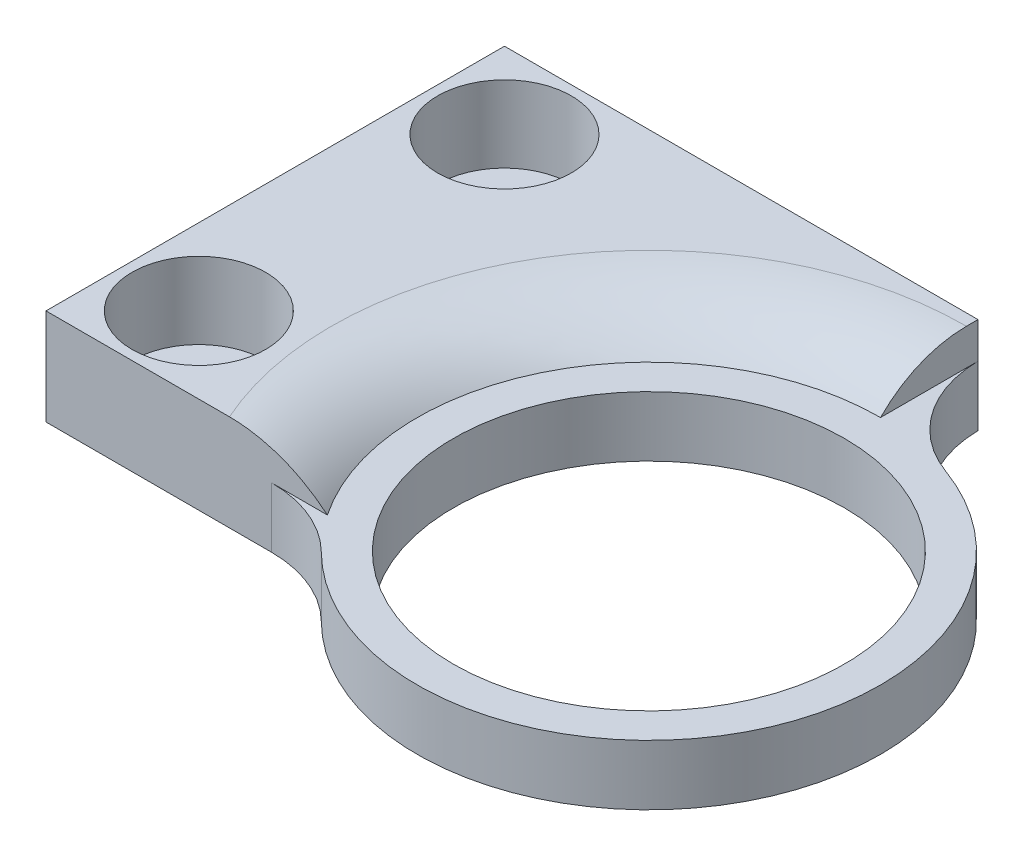
ISO-10303-21;
HEADER;
FILE_DESCRIPTION(('STEP AP214'),'2;1');
FILE_NAME('part.step','',(''),(''),'','','');
FILE_SCHEMA(('AUTOMOTIVE_DESIGN { 1 0 10303 214 1 1 1 1 }'));
ENDSEC;
DATA;
#1=APPLICATION_CONTEXT('core data for automotive mechanical design processes');
#2=APPLICATION_PROTOCOL_DEFINITION('international standard','automotive_design',2000,#1);
#3=PRODUCT_CONTEXT('',#1,'mechanical');
#4=PRODUCT('Part','Part','',(#3));
#5=PRODUCT_RELATED_PRODUCT_CATEGORY('part','',(#4));
#6=PRODUCT_DEFINITION_FORMATION('','',#4);
#7=PRODUCT_DEFINITION_CONTEXT('part definition',#1,'design');
#8=PRODUCT_DEFINITION('design','',#6,#7);
#9=PRODUCT_DEFINITION_SHAPE('','',#8);
#10=(LENGTH_UNIT() NAMED_UNIT(*) SI_UNIT(.MILLI.,.METRE.));
#11=(NAMED_UNIT(*) PLANE_ANGLE_UNIT() SI_UNIT($,.RADIAN.));
#12=(NAMED_UNIT(*) SI_UNIT($,.STERADIAN.) SOLID_ANGLE_UNIT());
#13=UNCERTAINTY_MEASURE_WITH_UNIT(LENGTH_MEASURE(1.E-05),#10,'distance_accuracy_value','');
#14=(GEOMETRIC_REPRESENTATION_CONTEXT(3) GLOBAL_UNCERTAINTY_ASSIGNED_CONTEXT((#13)) GLOBAL_UNIT_ASSIGNED_CONTEXT((#10,
#11,#12)) REPRESENTATION_CONTEXT('',''));
#15=CARTESIAN_POINT('',(0.,0.,0.));
#16=DIRECTION('',(0.,0.,1.));
#17=DIRECTION('',(1.,0.,0.));
#18=AXIS2_PLACEMENT_3D('',#15,#16,#17);
#19=CARTESIAN_POINT('',(0.,5.,0.));
#20=DIRECTION('',(0.,1.,0.));
#21=DIRECTION('',(0.,0.,1.));
#22=AXIS2_PLACEMENT_3D('',#19,#20,#21);
#23=PLANE('',#22);
#24=CARTESIAN_POINT('',(0.,5.,0.));
#25=DIRECTION('',(0.,1.,0.));
#26=DIRECTION('',(0.,0.,1.));
#27=AXIS2_PLACEMENT_3D('',#24,#25,#26);
#28=CIRCLE('',#27,19.25);
#29=CARTESIAN_POINT('',(0.,5.,-19.25));
#30=VERTEX_POINT('',#29);
#31=CARTESIAN_POINT('',(-15.9687194226725,5.,10.7499999999982));
#32=VERTEX_POINT('',#31);
#33=EDGE_CURVE('E149',#30,#32,#28,.T.);
#34=ORIENTED_EDGE('',*,*,#33,.T.);
#35=DIRECTION('',(1.,0.,0.));
#36=VECTOR('',#35,1.);
#37=CARTESIAN_POINT('',(0.,5.,10.7499999999982));
#38=LINE('',#37,#36);
#39=CARTESIAN_POINT('',(-20.6155281280901,5.,10.7499999999982));
#40=VERTEX_POINT('',#39);
#41=EDGE_CURVE('E161',#40,#32,#38,.T.);
#42=ORIENTED_EDGE('',*,*,#41,.F.);
#43=CARTESIAN_POINT('',(-20.6155281280901,5.,20.7499999999982));
#44=DIRECTION('',(0.,1.,0.));
#45=DIRECTION('',(0.,0.,1.));
#46=AXIS2_PLACEMENT_3D('',#43,#44,#45);
#47=CIRCLE('',#46,10.);
#48=CARTESIAN_POINT('',(-13.5674843236149,5.,13.6559829059817));
#49=VERTEX_POINT('',#48);
#50=EDGE_CURVE('E224',#40,#49,#47,.F.);
#51=ORIENTED_EDGE('',*,*,#50,.T.);
#52=CARTESIAN_POINT('',(6.58057131703336,5.,-18.0902896920264));
#53=VERTEX_POINT('',#52);
#54=EDGE_CURVE('E152',#49,#53,#28,.T.);
#55=ORIENTED_EDGE('',*,*,#54,.T.);
#56=CARTESIAN_POINT('',(9.99904992328446,5.,-27.4878427787934));
#57=DIRECTION('',(0.,1.,0.));
#58=DIRECTION('',(0.,0.,1.));
#59=AXIS2_PLACEMENT_3D('',#56,#57,#58);
#60=CIRCLE('',#59,10.);
#61=CARTESIAN_POINT('',(0.,5.,-27.3500000000018));
#62=VERTEX_POINT('',#61);
#63=EDGE_CURVE('E44',#53,#62,#60,.F.);
#64=ORIENTED_EDGE('',*,*,#63,.T.);
#65=DIRECTION('',(0.,0.,-1.));
#66=VECTOR('',#65,1.);
#67=CARTESIAN_POINT('',(0.,5.,0.));
#68=LINE('',#67,#66);
#69=EDGE_CURVE('E51',#30,#62,#68,.T.);
#70=ORIENTED_EDGE('',*,*,#69,.F.);
#71=EDGE_LOOP('',(#34,#42,#51,#55,#64,#70));
#72=FACE_BOUND('',#71,.T.);
#73=CARTESIAN_POINT('',(0.,5.,0.));
#74=DIRECTION('',(0.,1.,0.));
#75=DIRECTION('',(0.,0.,1.));
#76=AXIS2_PLACEMENT_3D('',#73,#74,#75);
#77=CIRCLE('',#76,16.25);
#78=CARTESIAN_POINT('',(0.,5.,16.25));
#79=VERTEX_POINT('',#78);
#80=EDGE_CURVE('E143',#79,#79,#77,.T.);
#81=ORIENTED_EDGE('',*,*,#80,.F.);
#82=EDGE_LOOP('',(#81));
#83=FACE_BOUND('',#82,.T.);
#84=ADVANCED_FACE('F35',(#72,#83),#23,.T.);
#85=CARTESIAN_POINT('',(0.,0.,0.));
#86=DIRECTION('',(0.,1.,0.));
#87=DIRECTION('',(0.,0.,1.));
#88=AXIS2_PLACEMENT_3D('',#85,#86,#87);
#89=PLANE('',#88);
#90=CARTESIAN_POINT('',(-32.9999999999974,0.,-21.0000000000018));
#91=DIRECTION('',(0.,1.,0.));
#92=DIRECTION('',(0.,0.,1.));
#93=AXIS2_PLACEMENT_3D('',#90,#91,#92);
#94=CIRCLE('',#93,3.3782);
#95=CARTESIAN_POINT('',(-32.9999999999974,0.,-17.6218000000018));
#96=VERTEX_POINT('',#95);
#97=EDGE_CURVE('E384',#96,#96,#94,.T.);
#98=ORIENTED_EDGE('',*,*,#97,.T.);
#99=EDGE_LOOP('',(#98));
#100=FACE_BOUND('',#99,.T.);
#101=CARTESIAN_POINT('',(-32.9999999999971,0.,4.39999999999821));
#102=DIRECTION('',(0.,1.,0.));
#103=DIRECTION('',(0.,0.,1.));
#104=AXIS2_PLACEMENT_3D('',#101,#102,#103);
#105=CIRCLE('',#104,3.3782);
#106=CARTESIAN_POINT('',(-32.9999999999971,0.,7.77819999999821));
#107=VERTEX_POINT('',#106);
#108=EDGE_CURVE('E136',#107,#107,#105,.T.);
#109=ORIENTED_EDGE('',*,*,#108,.T.);
#110=EDGE_LOOP('',(#109));
#111=FACE_BOUND('',#110,.T.);
#112=CARTESIAN_POINT('',(0.,0.,0.));
#113=DIRECTION('',(0.,1.,0.));
#114=DIRECTION('',(0.,0.,1.));
#115=AXIS2_PLACEMENT_3D('',#112,#113,#114);
#116=CIRCLE('',#115,19.25);
#117=CARTESIAN_POINT('',(-13.5674843236149,0.,13.6559829059817));
#118=VERTEX_POINT('',#117);
#119=CARTESIAN_POINT('',(6.58057131703336,0.,-18.0902896920264));
#120=VERTEX_POINT('',#119);
#121=EDGE_CURVE('E146',#118,#120,#116,.T.);
#122=ORIENTED_EDGE('',*,*,#121,.F.);
#123=CARTESIAN_POINT('',(-20.6155281280901,0.,20.7499999999982));
#124=DIRECTION('',(0.,1.,0.));
#125=DIRECTION('',(0.,0.,1.));
#126=AXIS2_PLACEMENT_3D('',#123,#124,#125);
#127=CIRCLE('',#126,10.);
#128=CARTESIAN_POINT('',(-20.6155281280901,0.,10.7499999999982));
#129=VERTEX_POINT('',#128);
#130=EDGE_CURVE('E226',#118,#129,#127,.T.);
#131=ORIENTED_EDGE('',*,*,#130,.T.);
#132=DIRECTION('',(1.,0.,0.));
#133=VECTOR('',#132,1.);
#134=CARTESIAN_POINT('',(0.,0.,10.7499999999982));
#135=LINE('',#134,#133);
#136=CARTESIAN_POINT('',(-39.3499999999971,0.,10.7499999999982));
#137=VERTEX_POINT('',#136);
#138=EDGE_CURVE('E118',#137,#129,#135,.T.);
#139=ORIENTED_EDGE('',*,*,#138,.F.);
#140=DIRECTION('',(0.,0.,1.));
#141=VECTOR('',#140,1.);
#142=CARTESIAN_POINT('',(-39.3499999999971,0.,0.));
#143=LINE('',#142,#141);
#144=CARTESIAN_POINT('',(-39.3499999999971,0.,-27.3500000000018));
#145=VERTEX_POINT('',#144);
#146=EDGE_CURVE('E135',#145,#137,#143,.T.);
#147=ORIENTED_EDGE('',*,*,#146,.F.);
#148=DIRECTION('',(1.,0.,0.));
#149=VECTOR('',#148,1.);
#150=CARTESIAN_POINT('',(0.,0.,-27.3500000000018));
#151=LINE('',#150,#149);
#152=CARTESIAN_POINT('',(0.,0.,-27.3500000000018));
#153=VERTEX_POINT('',#152);
#154=EDGE_CURVE('E132',#145,#153,#151,.T.);
#155=ORIENTED_EDGE('',*,*,#154,.T.);
#156=CARTESIAN_POINT('',(9.99904992328446,0.,-27.4878427787934));
#157=DIRECTION('',(0.,1.,0.));
#158=DIRECTION('',(0.,0.,1.));
#159=AXIS2_PLACEMENT_3D('',#156,#157,#158);
#160=CIRCLE('',#159,10.);
#161=EDGE_CURVE('E11',#153,#120,#160,.T.);
#162=ORIENTED_EDGE('',*,*,#161,.T.);
#163=EDGE_LOOP('',(#122,#131,#139,#147,#155,#162));
#164=FACE_BOUND('',#163,.T.);
#165=CARTESIAN_POINT('',(0.,0.,0.));
#166=DIRECTION('',(0.,1.,0.));
#167=DIRECTION('',(0.,0.,1.));
#168=AXIS2_PLACEMENT_3D('',#165,#166,#167);
#169=CIRCLE('',#168,16.25);
#170=CARTESIAN_POINT('',(0.,0.,16.25));
#171=VERTEX_POINT('',#170);
#172=EDGE_CURVE('E112',#171,#171,#169,.T.);
#173=ORIENTED_EDGE('',*,*,#172,.T.);
#174=EDGE_LOOP('',(#173));
#175=FACE_BOUND('',#174,.T.);
#176=ADVANCED_FACE('F185',(#100,#111,#164,#175),#89,.F.);
#177=CARTESIAN_POINT('',(0.,5.,0.));
#178=DIRECTION('',(0.,-1.,0.));
#179=DIRECTION('',(0.,0.,-1.));
#180=AXIS2_PLACEMENT_3D('',#177,#178,#179);
#181=CYLINDRICAL_SURFACE('',#180,19.25);
#182=ORIENTED_EDGE('',*,*,#54,.F.);
#183=DIRECTION('',(0.,-1.,0.));
#184=VECTOR('',#183,1.);
#185=CARTESIAN_POINT('',(-13.5674843236149,5.,13.6559829059817));
#186=LINE('',#185,#184);
#187=EDGE_CURVE('E215',#49,#118,#186,.T.);
#188=ORIENTED_EDGE('',*,*,#187,.T.);
#189=ORIENTED_EDGE('',*,*,#121,.T.);
#190=DIRECTION('',(0.,-1.,0.));
#191=VECTOR('',#190,1.);
#192=CARTESIAN_POINT('',(6.58057131703336,5.,-18.0902896920264));
#193=LINE('',#192,#191);
#194=EDGE_CURVE('E206',#120,#53,#193,.F.);
#195=ORIENTED_EDGE('',*,*,#194,.T.);
#196=EDGE_LOOP('',(#182,#188,#189,#195));
#197=FACE_BOUND('',#196,.T.);
#198=ADVANCED_FACE('F181',(#197),#181,.T.);
#199=CARTESIAN_POINT('',(0.,5.,0.));
#200=DIRECTION('',(0.,-1.,0.));
#201=DIRECTION('',(0.,0.,-1.));
#202=AXIS2_PLACEMENT_3D('',#199,#200,#201);
#203=CYLINDRICAL_SURFACE('',#202,16.25);
#204=ORIENTED_EDGE('',*,*,#80,.T.);
#205=EDGE_LOOP('',(#204));
#206=FACE_BOUND('',#205,.T.);
#207=ORIENTED_EDGE('',*,*,#172,.F.);
#208=EDGE_LOOP('',(#207));
#209=FACE_BOUND('',#208,.T.);
#210=ADVANCED_FACE('F178',(#206,#209),#203,.F.);
#211=CARTESIAN_POINT('',(0.,8.,0.));
#212=DIRECTION('',(1.,0.,0.));
#213=DIRECTION('',(0.,0.,-1.));
#214=AXIS2_PLACEMENT_3D('',#211,#212,#213);
#215=PLANE('',#214);
#216=CARTESIAN_POINT('',(0.,-2.,-26.3914284285428));
#217=DIRECTION('',(1.,0.,0.));
#218=DIRECTION('',(0.,0.,-1.));
#219=AXIS2_PLACEMENT_3D('',#216,#217,#218);
#220=CIRCLE('',#219,10.);
#221=CARTESIAN_POINT('',(0.,8.,-26.3914284285428));
#222=VERTEX_POINT('',#221);
#223=EDGE_CURVE('E216',#222,#30,#220,.T.);
#224=ORIENTED_EDGE('',*,*,#223,.T.);
#225=ORIENTED_EDGE('',*,*,#69,.T.);
#226=DIRECTION('',(0.,-1.,0.));
#227=VECTOR('',#226,1.);
#228=CARTESIAN_POINT('',(0.,8.,-27.3500000000018));
#229=LINE('',#228,#227);
#230=CARTESIAN_POINT('',(0.,8.,-27.3500000000018));
#231=VERTEX_POINT('',#230);
#232=EDGE_CURVE('E105',#231,#62,#229,.T.);
#233=ORIENTED_EDGE('',*,*,#232,.F.);
#234=DIRECTION('',(0.,0.,1.));
#235=VECTOR('',#234,1.);
#236=CARTESIAN_POINT('',(0.,8.,0.));
#237=LINE('',#236,#235);
#238=EDGE_CURVE('E107',#231,#222,#237,.T.);
#239=ORIENTED_EDGE('',*,*,#238,.T.);
#240=EDGE_LOOP('',(#224,#225,#233,#239));
#241=FACE_BOUND('',#240,.T.);
#242=ADVANCED_FACE('F106',(#241),#215,.T.);
#243=CARTESIAN_POINT('',(0.,8.,-27.3500000000018));
#244=DIRECTION('',(0.,0.,-1.));
#245=DIRECTION('',(-1.,0.,0.));
#246=AXIS2_PLACEMENT_3D('',#243,#244,#245);
#247=PLANE('',#246);
#248=ORIENTED_EDGE('',*,*,#154,.F.);
#249=DIRECTION('',(0.,-1.,0.));
#250=VECTOR('',#249,1.);
#251=CARTESIAN_POINT('',(-39.3499999999971,8.,-27.3500000000018));
#252=LINE('',#251,#250);
#253=CARTESIAN_POINT('',(-39.3499999999971,8.,-27.3500000000018));
#254=VERTEX_POINT('',#253);
#255=EDGE_CURVE('E122',#254,#145,#252,.T.);
#256=ORIENTED_EDGE('',*,*,#255,.F.);
#257=DIRECTION('',(1.,0.,0.));
#258=VECTOR('',#257,1.);
#259=CARTESIAN_POINT('',(0.,8.,-27.3500000000018));
#260=LINE('',#259,#258);
#261=EDGE_CURVE('E117',#254,#231,#260,.T.);
#262=ORIENTED_EDGE('',*,*,#261,.T.);
#263=ORIENTED_EDGE('',*,*,#232,.T.);
#264=EDGE_CURVE('E113',#62,#153,#229,.T.);
#265=ORIENTED_EDGE('',*,*,#264,.T.);
#266=EDGE_LOOP('',(#248,#256,#262,#263,#265));
#267=FACE_BOUND('',#266,.T.);
#268=ADVANCED_FACE('F121',(#267),#247,.T.);
#269=CARTESIAN_POINT('',(-39.3499999999971,8.,0.));
#270=DIRECTION('',(1.,0.,0.));
#271=DIRECTION('',(0.,0.,-1.));
#272=AXIS2_PLACEMENT_3D('',#269,#270,#271);
#273=PLANE('',#272);
#274=ORIENTED_EDGE('',*,*,#146,.T.);
#275=DIRECTION('',(0.,-1.,0.));
#276=VECTOR('',#275,1.);
#277=CARTESIAN_POINT('',(-39.3499999999971,8.,10.7499999999982));
#278=LINE('',#277,#276);
#279=CARTESIAN_POINT('',(-39.3499999999971,8.,10.7499999999982));
#280=VERTEX_POINT('',#279);
#281=EDGE_CURVE('E131',#280,#137,#278,.T.);
#282=ORIENTED_EDGE('',*,*,#281,.F.);
#283=DIRECTION('',(0.,0.,1.));
#284=VECTOR('',#283,1.);
#285=CARTESIAN_POINT('',(-39.3499999999971,8.,0.));
#286=LINE('',#285,#284);
#287=EDGE_CURVE('E124',#254,#280,#286,.T.);
#288=ORIENTED_EDGE('',*,*,#287,.F.);
#289=ORIENTED_EDGE('',*,*,#255,.T.);
#290=EDGE_LOOP('',(#274,#282,#288,#289));
#291=FACE_BOUND('',#290,.T.);
#292=ADVANCED_FACE('F168',(#291),#273,.F.);
#293=CARTESIAN_POINT('',(0.,8.,10.7499999999982));
#294=DIRECTION('',(0.,0.,-1.));
#295=DIRECTION('',(-1.,0.,0.));
#296=AXIS2_PLACEMENT_3D('',#293,#294,#295);
#297=PLANE('',#296);
#298=ORIENTED_EDGE('',*,*,#138,.T.);
#299=DIRECTION('',(0.,1.,0.));
#300=VECTOR('',#299,1.);
#301=CARTESIAN_POINT('',(-20.6155281280901,5.,10.7499999999982));
#302=LINE('',#301,#300);
#303=EDGE_CURVE('E219',#129,#40,#302,.T.);
#304=ORIENTED_EDGE('',*,*,#303,.T.);
#305=ORIENTED_EDGE('',*,*,#41,.T.);
#306=CARTESIAN_POINT('',(-15.9687194226725,5.,10.7499999999982));
#307=CARTESIAN_POINT('',(-16.246173790152,5.23475237205624,10.7499999999982));
#308=CARTESIAN_POINT('',(-16.5339958005839,5.45714706764806,10.7499999999982));
#309=CARTESIAN_POINT('',(-17.1276889374778,5.87618258773226,10.7499999999982));
#310=CARTESIAN_POINT('',(-17.4335543314244,6.07283152859709,10.7499999999982));
#311=CARTESIAN_POINT('',(-18.0519032453309,6.43427065201574,10.7499999999982));
#312=CARTESIAN_POINT('',(-18.3639508725232,6.59980808154155,10.7499999999982));
#313=CARTESIAN_POINT('',(-19.0005967126287,6.90477859122829,10.7499999999982));
#314=CARTESIAN_POINT('',(-19.3251964301792,7.04420853007031,10.7499999999982));
#315=CARTESIAN_POINT('',(-20.0037800624977,7.30316901094568,10.7499999999982));
#316=CARTESIAN_POINT('',(-20.3583795636922,7.42109075545833,10.7499999999982));
#317=CARTESIAN_POINT('',(-21.0765454334606,7.62531772689788,10.7499999999982));
#318=CARTESIAN_POINT('',(-21.4401111917529,7.71162509932849,10.7499999999982));
#319=CARTESIAN_POINT('',(-22.1848738797799,7.85358919656463,10.7499999999982));
#320=CARTESIAN_POINT('',(-22.5662684361,7.90821610892993,10.7499999999982));
#321=CARTESIAN_POINT('',(-23.332679810577,7.98144848894861,10.7499999999982));
#322=CARTESIAN_POINT('',(-23.7176983475239,8.00003589873812,10.7499999999982));
#323=CARTESIAN_POINT('',(-24.1028005530257,8.,10.7499999999982));
#324=B_SPLINE_CURVE_WITH_KNOTS('',3,(#306,#307,#308,#309,#310,#311,#312,#313,#314,#315,#316,
#317,#318,#319,#320,#321,#322,#323),.UNSPECIFIED.,.F.,.F.,(4,2,2,2,2,2,2,2,4),(0.,
1.08987293026641,2.17940144551217,3.23793111165387,4.29658806101676,5.41622356795939,
6.5357830769544,7.6899463171948,8.84468771031546),.UNSPECIFIED.);
#325=CARTESIAN_POINT('',(-24.1028005530257,8.,10.7499999999982));
#326=VERTEX_POINT('',#325);
#327=EDGE_CURVE('E151',#32,#326,#324,.T.);
#328=ORIENTED_EDGE('',*,*,#327,.T.);
#329=DIRECTION('',(1.,0.,0.));
#330=VECTOR('',#329,1.);
#331=CARTESIAN_POINT('',(0.,8.,10.7499999999982));
#332=LINE('',#331,#330);
#333=EDGE_CURVE('E126',#280,#326,#332,.T.);
#334=ORIENTED_EDGE('',*,*,#333,.F.);
#335=ORIENTED_EDGE('',*,*,#281,.T.);
#336=EDGE_LOOP('',(#298,#304,#305,#328,#334,#335));
#337=FACE_BOUND('',#336,.T.);
#338=ADVANCED_FACE('F163',(#337),#297,.F.);
#339=CARTESIAN_POINT('',(0.,8.,0.));
#340=DIRECTION('',(0.,1.,0.));
#341=DIRECTION('',(0.,0.,1.));
#342=AXIS2_PLACEMENT_3D('',#339,#340,#341);
#343=PLANE('',#342);
#344=CARTESIAN_POINT('',(-32.9999999999974,8.,-21.0000000000018));
#345=DIRECTION('',(0.,1.,0.));
#346=DIRECTION('',(0.,0.,1.));
#347=AXIS2_PLACEMENT_3D('',#344,#345,#346);
#348=CIRCLE('',#347,5.55625);
#349=CARTESIAN_POINT('',(-32.9999999999974,8.,-15.4437500000018));
#350=VERTEX_POINT('',#349);
#351=EDGE_CURVE('E393',#350,#350,#348,.T.);
#352=ORIENTED_EDGE('',*,*,#351,.F.);
#353=EDGE_LOOP('',(#352));
#354=FACE_BOUND('',#353,.T.);
#355=CARTESIAN_POINT('',(-32.9999999999971,8.,4.39999999999821));
#356=DIRECTION('',(0.,1.,0.));
#357=DIRECTION('',(0.,0.,1.));
#358=AXIS2_PLACEMENT_3D('',#355,#356,#357);
#359=CIRCLE('',#358,5.55625);
#360=CARTESIAN_POINT('',(-32.9999999999971,8.,9.95624999999821));
#361=VERTEX_POINT('',#360);
#362=EDGE_CURVE('E379',#361,#361,#359,.T.);
#363=ORIENTED_EDGE('',*,*,#362,.F.);
#364=EDGE_LOOP('',(#363));
#365=FACE_BOUND('',#364,.T.);
#366=ORIENTED_EDGE('',*,*,#333,.T.);
#367=CARTESIAN_POINT('',(0.,8.,0.));
#368=DIRECTION('',(0.,1.,0.));
#369=DIRECTION('',(0.,0.,1.));
#370=AXIS2_PLACEMENT_3D('',#367,#368,#369);
#371=CIRCLE('',#370,26.3914284285428);
#372=EDGE_CURVE('E59',#326,#222,#371,.F.);
#373=ORIENTED_EDGE('',*,*,#372,.T.);
#374=ORIENTED_EDGE('',*,*,#238,.F.);
#375=ORIENTED_EDGE('',*,*,#261,.F.);
#376=ORIENTED_EDGE('',*,*,#287,.T.);
#377=EDGE_LOOP('',(#366,#373,#374,#375,#376));
#378=FACE_BOUND('',#377,.T.);
#379=ADVANCED_FACE('F116',(#354,#365,#378),#343,.T.);
#380=CARTESIAN_POINT('',(-32.9999999999971,8.,4.39999999999821));
#381=DIRECTION('',(0.,1.,0.));
#382=DIRECTION('',(0.,0.,1.));
#383=AXIS2_PLACEMENT_3D('',#380,#381,#382);
#384=CYLINDRICAL_SURFACE('',#383,3.3782);
#385=ORIENTED_EDGE('',*,*,#108,.F.);
#386=EDGE_LOOP('',(#385));
#387=FACE_BOUND('',#386,.T.);
#388=CARTESIAN_POINT('',(-32.9999999999971,1.65,4.39999999999821));
#389=DIRECTION('',(0.,1.,0.));
#390=DIRECTION('',(0.,0.,1.));
#391=AXIS2_PLACEMENT_3D('',#388,#389,#390);
#392=CIRCLE('',#391,3.37820000000001);
#393=CARTESIAN_POINT('',(-32.9999999999971,1.65,7.77819999999822));
#394=VERTEX_POINT('',#393);
#395=EDGE_CURVE('E375',#394,#394,#392,.T.);
#396=ORIENTED_EDGE('',*,*,#395,.T.);
#397=EDGE_LOOP('',(#396));
#398=FACE_BOUND('',#397,.T.);
#399=ADVANCED_FACE('F262',(#387,#398),#384,.F.);
#400=CARTESIAN_POINT('',(-29.6217999999971,1.65,4.39999999999821));
#401=DIRECTION('',(0.,-1.,0.));
#402=DIRECTION('',(0.,0.,-1.));
#403=AXIS2_PLACEMENT_3D('',#400,#401,#402);
#404=PLANE('',#403);
#405=ORIENTED_EDGE('',*,*,#395,.F.);
#406=EDGE_LOOP('',(#405));
#407=FACE_BOUND('',#406,.T.);
#408=CARTESIAN_POINT('',(-32.9999999999971,1.65,4.39999999999821));
#409=DIRECTION('',(0.,1.,0.));
#410=DIRECTION('',(0.,0.,1.));
#411=AXIS2_PLACEMENT_3D('',#408,#409,#410);
#412=CIRCLE('',#411,5.55625);
#413=CARTESIAN_POINT('',(-32.9999999999971,1.65,9.95624999999821));
#414=VERTEX_POINT('',#413);
#415=EDGE_CURVE('E376',#414,#414,#412,.T.);
#416=ORIENTED_EDGE('',*,*,#415,.T.);
#417=EDGE_LOOP('',(#416));
#418=FACE_BOUND('',#417,.T.);
#419=ADVANCED_FACE('F340',(#407,#418),#404,.F.);
#420=CARTESIAN_POINT('',(-32.9999999999971,8.,4.39999999999821));
#421=DIRECTION('',(0.,1.,0.));
#422=DIRECTION('',(0.,0.,1.));
#423=AXIS2_PLACEMENT_3D('',#420,#421,#422);
#424=CYLINDRICAL_SURFACE('',#423,5.55625);
#425=ORIENTED_EDGE('',*,*,#415,.F.);
#426=EDGE_LOOP('',(#425));
#427=FACE_BOUND('',#426,.T.);
#428=ORIENTED_EDGE('',*,*,#362,.T.);
#429=EDGE_LOOP('',(#428));
#430=FACE_BOUND('',#429,.T.);
#431=ADVANCED_FACE('F330',(#427,#430),#424,.F.);
#432=CARTESIAN_POINT('',(-32.9999999999974,8.,-21.0000000000018));
#433=DIRECTION('',(0.,1.,0.));
#434=DIRECTION('',(0.,0.,1.));
#435=AXIS2_PLACEMENT_3D('',#432,#433,#434);
#436=CYLINDRICAL_SURFACE('',#435,3.3782);
#437=ORIENTED_EDGE('',*,*,#97,.F.);
#438=EDGE_LOOP('',(#437));
#439=FACE_BOUND('',#438,.T.);
#440=CARTESIAN_POINT('',(-32.9999999999974,1.65,-21.0000000000018));
#441=DIRECTION('',(0.,1.,0.));
#442=DIRECTION('',(0.,0.,1.));
#443=AXIS2_PLACEMENT_3D('',#440,#441,#442);
#444=CIRCLE('',#443,3.37820000000001);
#445=CARTESIAN_POINT('',(-32.9999999999974,1.65,-17.6218000000018));
#446=VERTEX_POINT('',#445);
#447=EDGE_CURVE('E387',#446,#446,#444,.T.);
#448=ORIENTED_EDGE('',*,*,#447,.T.);
#449=EDGE_LOOP('',(#448));
#450=FACE_BOUND('',#449,.T.);
#451=ADVANCED_FACE('F320',(#439,#450),#436,.F.);
#452=CARTESIAN_POINT('',(-29.6217999999974,1.65,-21.0000000000018));
#453=DIRECTION('',(0.,-1.,0.));
#454=DIRECTION('',(0.,0.,-1.));
#455=AXIS2_PLACEMENT_3D('',#452,#453,#454);
#456=PLANE('',#455);
#457=ORIENTED_EDGE('',*,*,#447,.F.);
#458=EDGE_LOOP('',(#457));
#459=FACE_BOUND('',#458,.T.);
#460=CARTESIAN_POINT('',(-32.9999999999974,1.65,-21.0000000000018));
#461=DIRECTION('',(0.,1.,0.));
#462=DIRECTION('',(0.,0.,1.));
#463=AXIS2_PLACEMENT_3D('',#460,#461,#462);
#464=CIRCLE('',#463,5.55625);
#465=CARTESIAN_POINT('',(-32.9999999999974,1.65,-15.4437500000018));
#466=VERTEX_POINT('',#465);
#467=EDGE_CURVE('E390',#466,#466,#464,.T.);
#468=ORIENTED_EDGE('',*,*,#467,.T.);
#469=EDGE_LOOP('',(#468));
#470=FACE_BOUND('',#469,.T.);
#471=ADVANCED_FACE('F310',(#459,#470),#456,.F.);
#472=CARTESIAN_POINT('',(-32.9999999999974,8.,-21.0000000000018));
#473=DIRECTION('',(0.,1.,0.));
#474=DIRECTION('',(0.,0.,1.));
#475=AXIS2_PLACEMENT_3D('',#472,#473,#474);
#476=CYLINDRICAL_SURFACE('',#475,5.55625);
#477=ORIENTED_EDGE('',*,*,#467,.F.);
#478=EDGE_LOOP('',(#477));
#479=FACE_BOUND('',#478,.T.);
#480=ORIENTED_EDGE('',*,*,#351,.T.);
#481=EDGE_LOOP('',(#480));
#482=FACE_BOUND('',#481,.T.);
#483=ADVANCED_FACE('F195',(#479,#482),#476,.F.);
#484=CARTESIAN_POINT('',(-20.6155281280901,5.,20.7499999999982));
#485=DIRECTION('',(0.,-1.,0.));
#486=DIRECTION('',(0.,0.,-1.));
#487=AXIS2_PLACEMENT_3D('',#484,#485,#486);
#488=CYLINDRICAL_SURFACE('',#487,10.);
#489=ORIENTED_EDGE('',*,*,#130,.F.);
#490=ORIENTED_EDGE('',*,*,#187,.F.);
#491=ORIENTED_EDGE('',*,*,#50,.F.);
#492=ORIENTED_EDGE('',*,*,#303,.F.);
#493=EDGE_LOOP('',(#489,#490,#491,#492));
#494=FACE_BOUND('',#493,.T.);
#495=ADVANCED_FACE('F192',(#494),#488,.F.);
#496=CARTESIAN_POINT('',(9.99904992328446,8.,-27.4878427787934));
#497=DIRECTION('',(0.,-1.,0.));
#498=DIRECTION('',(0.,0.,-1.));
#499=AXIS2_PLACEMENT_3D('',#496,#497,#498);
#500=CYLINDRICAL_SURFACE('',#499,10.);
#501=ORIENTED_EDGE('',*,*,#161,.F.);
#502=ORIENTED_EDGE('',*,*,#264,.F.);
#503=ORIENTED_EDGE('',*,*,#63,.F.);
#504=ORIENTED_EDGE('',*,*,#194,.F.);
#505=EDGE_LOOP('',(#501,#502,#503,#504));
#506=FACE_BOUND('',#505,.T.);
#507=ADVANCED_FACE('F194',(#506),#500,.F.);
#508=CARTESIAN_POINT('',(0.,-2.,0.));
#509=DIRECTION('',(0.,1.,0.));
#510=DIRECTION('',(0.,0.,1.));
#511=AXIS2_PLACEMENT_3D('',#508,#509,#510);
#512=TOROIDAL_SURFACE('',#511,26.3914284285428,10.);
#513=ORIENTED_EDGE('',*,*,#223,.F.);
#514=ORIENTED_EDGE('',*,*,#372,.F.);
#515=ORIENTED_EDGE('',*,*,#327,.F.);
#516=ORIENTED_EDGE('',*,*,#33,.F.);
#517=EDGE_LOOP('',(#513,#514,#515,#516));
#518=FACE_BOUND('',#517,.T.);
#519=ADVANCED_FACE('F37',(#518),#512,.T.);
#520=CLOSED_SHELL('',(#84,#176,#198,#210,#242,#268,#292,#338,#379,#399,#419,#431,#451,#471,#483,
#495,#507,#519));
#521=MANIFOLD_SOLID_BREP('B2',#520);
#522=ADVANCED_BREP_SHAPE_REPRESENTATION('',(#18,#521),#14);
#523=SHAPE_DEFINITION_REPRESENTATION(#9,#522);
ENDSEC;
END-ISO-10303-21;
